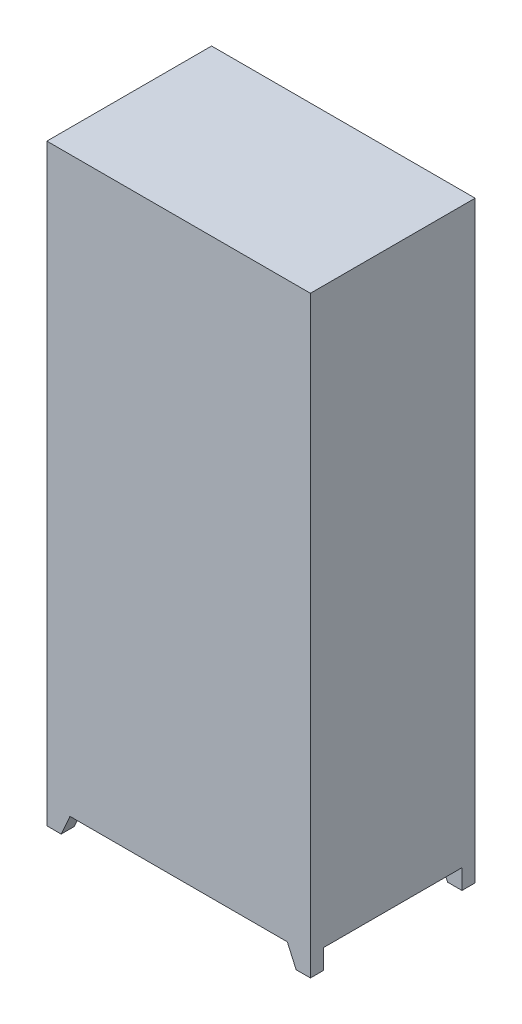
ISO-10303-21;
HEADER;
FILE_DESCRIPTION(('STEP AP214'),'2;1');
FILE_NAME('part.step','',(''),(''),'','','');
FILE_SCHEMA(('AUTOMOTIVE_DESIGN { 1 0 10303 214 1 1 1 1 }'));
ENDSEC;
DATA;
#1=APPLICATION_CONTEXT('core data for automotive mechanical design processes');
#2=APPLICATION_PROTOCOL_DEFINITION('international standard','automotive_design',2000,#1);
#3=PRODUCT_CONTEXT('',#1,'mechanical');
#4=PRODUCT('Part','Part','',(#3));
#5=PRODUCT_RELATED_PRODUCT_CATEGORY('part','',(#4));
#6=PRODUCT_DEFINITION_FORMATION('','',#4);
#7=PRODUCT_DEFINITION_CONTEXT('part definition',#1,'design');
#8=PRODUCT_DEFINITION('design','',#6,#7);
#9=PRODUCT_DEFINITION_SHAPE('','',#8);
#10=(LENGTH_UNIT() NAMED_UNIT(*) SI_UNIT(.MILLI.,.METRE.));
#11=(NAMED_UNIT(*) PLANE_ANGLE_UNIT() SI_UNIT($,.RADIAN.));
#12=(NAMED_UNIT(*) SI_UNIT($,.STERADIAN.) SOLID_ANGLE_UNIT());
#13=UNCERTAINTY_MEASURE_WITH_UNIT(LENGTH_MEASURE(1.E-05),#10,'distance_accuracy_value','');
#14=(GEOMETRIC_REPRESENTATION_CONTEXT(3) GLOBAL_UNCERTAINTY_ASSIGNED_CONTEXT((#13)) GLOBAL_UNIT_ASSIGNED_CONTEXT((#10,
#11,#12)) REPRESENTATION_CONTEXT('',''));
#15=CARTESIAN_POINT('',(0.,0.,0.));
#16=DIRECTION('',(0.,0.,1.));
#17=DIRECTION('',(1.,0.,0.));
#18=AXIS2_PLACEMENT_3D('',#15,#16,#17);
#19=CARTESIAN_POINT('',(0.,-106.68,63.5));
#20=DIRECTION('',(0.,1.,0.));
#21=DIRECTION('',(-1.,0.,0.));
#22=AXIS2_PLACEMENT_3D('',#19,#20,#21);
#23=PLANE('',#22);
#24=DIRECTION('',(1.,0.,0.));
#25=VECTOR('',#24,1.);
#26=CARTESIAN_POINT('',(0.,-106.68,63.5));
#27=LINE('',#26,#25);
#28=CARTESIAN_POINT('',(-41.9005340757414,-106.68,63.5));
#29=VERTEX_POINT('',#28);
#30=CARTESIAN_POINT('',(41.9005340757413,-106.68,63.5));
#31=VERTEX_POINT('',#30);
#32=EDGE_CURVE('E323',#29,#31,#27,.T.);
#33=ORIENTED_EDGE('',*,*,#32,.F.);
#34=DIRECTION('',(0.,0.,1.));
#35=VECTOR('',#34,1.);
#36=CARTESIAN_POINT('',(-41.9005340757414,-106.68,58.42));
#37=LINE('',#36,#35);
#38=CARTESIAN_POINT('',(-41.9005340757414,-106.68,58.42));
#39=VERTEX_POINT('',#38);
#40=EDGE_CURVE('E220',#39,#29,#37,.T.);
#41=ORIENTED_EDGE('',*,*,#40,.F.);
#42=DIRECTION('',(-1.,0.,0.));
#43=VECTOR('',#42,1.);
#44=CARTESIAN_POINT('',(0.,-106.68,58.42));
#45=LINE('',#44,#43);
#46=CARTESIAN_POINT('',(-50.8,-106.68,58.42));
#47=VERTEX_POINT('',#46);
#48=EDGE_CURVE('E212',#39,#47,#45,.T.);
#49=ORIENTED_EDGE('',*,*,#48,.T.);
#50=DIRECTION('',(0.,0.,-1.));
#51=VECTOR('',#50,1.);
#52=CARTESIAN_POINT('',(-50.8,-106.68,63.5));
#53=LINE('',#52,#51);
#54=CARTESIAN_POINT('',(-50.8,-106.68,5.08));
#55=VERTEX_POINT('',#54);
#56=EDGE_CURVE('E324',#47,#55,#53,.T.);
#57=ORIENTED_EDGE('',*,*,#56,.T.);
#58=DIRECTION('',(-1.,0.,0.));
#59=VECTOR('',#58,1.);
#60=CARTESIAN_POINT('',(0.,-106.68,5.08));
#61=LINE('',#60,#59);
#62=CARTESIAN_POINT('',(-41.9005340757414,-106.68,5.08));
#63=VERTEX_POINT('',#62);
#64=EDGE_CURVE('E258',#63,#55,#61,.T.);
#65=ORIENTED_EDGE('',*,*,#64,.F.);
#66=DIRECTION('',(0.,0.,-1.));
#67=VECTOR('',#66,1.);
#68=CARTESIAN_POINT('',(-41.9005340757414,-106.68,5.08));
#69=LINE('',#68,#67);
#70=CARTESIAN_POINT('',(-41.9005340757414,-106.68,0.));
#71=VERTEX_POINT('',#70);
#72=EDGE_CURVE('E277',#63,#71,#69,.T.);
#73=ORIENTED_EDGE('',*,*,#72,.T.);
#74=DIRECTION('',(1.,0.,0.));
#75=VECTOR('',#74,1.);
#76=CARTESIAN_POINT('',(0.,-106.68,0.));
#77=LINE('',#76,#75);
#78=CARTESIAN_POINT('',(41.9005340757413,-106.68,0.));
#79=VERTEX_POINT('',#78);
#80=EDGE_CURVE('E302',#71,#79,#77,.T.);
#81=ORIENTED_EDGE('',*,*,#80,.T.);
#82=DIRECTION('',(0.,0.,-1.));
#83=VECTOR('',#82,1.);
#84=CARTESIAN_POINT('',(41.9005340757413,-106.68,5.08));
#85=LINE('',#84,#83);
#86=CARTESIAN_POINT('',(41.9005340757413,-106.68,5.08));
#87=VERTEX_POINT('',#86);
#88=EDGE_CURVE('E299',#87,#79,#85,.T.);
#89=ORIENTED_EDGE('',*,*,#88,.F.);
#90=DIRECTION('',(1.,0.,0.));
#91=VECTOR('',#90,1.);
#92=CARTESIAN_POINT('',(0.,-106.68,5.08));
#93=LINE('',#92,#91);
#94=CARTESIAN_POINT('',(50.8,-106.68,5.08));
#95=VERTEX_POINT('',#94);
#96=EDGE_CURVE('E286',#87,#95,#93,.T.);
#97=ORIENTED_EDGE('',*,*,#96,.T.);
#98=DIRECTION('',(0.,0.,-1.));
#99=VECTOR('',#98,1.);
#100=CARTESIAN_POINT('',(50.8,-106.68,63.5));
#101=LINE('',#100,#99);
#102=CARTESIAN_POINT('',(50.8,-106.68,58.42));
#103=VERTEX_POINT('',#102);
#104=EDGE_CURVE('E11',#103,#95,#101,.T.);
#105=ORIENTED_EDGE('',*,*,#104,.F.);
#106=DIRECTION('',(1.,0.,0.));
#107=VECTOR('',#106,1.);
#108=CARTESIAN_POINT('',(0.,-106.68,58.42));
#109=LINE('',#108,#107);
#110=CARTESIAN_POINT('',(41.9005340757413,-106.68,58.42));
#111=VERTEX_POINT('',#110);
#112=EDGE_CURVE('E231',#111,#103,#109,.T.);
#113=ORIENTED_EDGE('',*,*,#112,.F.);
#114=DIRECTION('',(0.,0.,1.));
#115=VECTOR('',#114,1.);
#116=CARTESIAN_POINT('',(41.9005340757413,-106.68,58.42));
#117=LINE('',#116,#115);
#118=EDGE_CURVE('E242',#111,#31,#117,.T.);
#119=ORIENTED_EDGE('',*,*,#118,.T.);
#120=EDGE_LOOP('',(#33,#41,#49,#57,#65,#73,#81,#89,#97,#105,#113,#119));
#121=FACE_BOUND('',#120,.T.);
#122=ADVANCED_FACE('F33',(#121),#23,.F.);
#123=CARTESIAN_POINT('',(50.8,0.,63.5));
#124=DIRECTION('',(-1.,0.,0.));
#125=DIRECTION('',(0.,0.,1.));
#126=AXIS2_PLACEMENT_3D('',#123,#124,#125);
#127=PLANE('',#126);
#128=DIRECTION('',(0.,1.,0.));
#129=VECTOR('',#128,1.);
#130=CARTESIAN_POINT('',(50.8,0.,0.));
#131=LINE('',#130,#129);
#132=CARTESIAN_POINT('',(50.8,-114.3,0.));
#133=VERTEX_POINT('',#132);
#134=CARTESIAN_POINT('',(50.8,114.3,0.));
#135=VERTEX_POINT('',#134);
#136=EDGE_CURVE('E310',#133,#135,#131,.T.);
#137=ORIENTED_EDGE('',*,*,#136,.T.);
#138=DIRECTION('',(0.,0.,-1.));
#139=VECTOR('',#138,1.);
#140=CARTESIAN_POINT('',(50.8,114.3,63.5));
#141=LINE('',#140,#139);
#142=CARTESIAN_POINT('',(50.8,114.3,63.5));
#143=VERTEX_POINT('',#142);
#144=EDGE_CURVE('E41',#143,#135,#141,.T.);
#145=ORIENTED_EDGE('',*,*,#144,.F.);
#146=DIRECTION('',(0.,1.,0.));
#147=VECTOR('',#146,1.);
#148=CARTESIAN_POINT('',(50.8,0.,63.5));
#149=LINE('',#148,#147);
#150=CARTESIAN_POINT('',(50.8,-114.3,63.5));
#151=VERTEX_POINT('',#150);
#152=EDGE_CURVE('E365',#151,#143,#149,.T.);
#153=ORIENTED_EDGE('',*,*,#152,.F.);
#154=DIRECTION('',(0.,0.,1.));
#155=VECTOR('',#154,1.);
#156=CARTESIAN_POINT('',(50.8,-114.3,58.42));
#157=LINE('',#156,#155);
#158=CARTESIAN_POINT('',(50.8,-114.3,58.42));
#159=VERTEX_POINT('',#158);
#160=EDGE_CURVE('E247',#159,#151,#157,.T.);
#161=ORIENTED_EDGE('',*,*,#160,.F.);
#162=DIRECTION('',(0.,1.,0.));
#163=VECTOR('',#162,1.);
#164=CARTESIAN_POINT('',(50.8,0.,58.42));
#165=LINE('',#164,#163);
#166=EDGE_CURVE('E239',#159,#103,#165,.T.);
#167=ORIENTED_EDGE('',*,*,#166,.T.);
#168=ORIENTED_EDGE('',*,*,#104,.T.);
#169=DIRECTION('',(0.,1.,0.));
#170=VECTOR('',#169,1.);
#171=CARTESIAN_POINT('',(50.8,0.,5.08));
#172=LINE('',#171,#170);
#173=CARTESIAN_POINT('',(50.8,-114.3,5.08));
#174=VERTEX_POINT('',#173);
#175=EDGE_CURVE('E292',#174,#95,#172,.T.);
#176=ORIENTED_EDGE('',*,*,#175,.F.);
#177=DIRECTION('',(0.,0.,-1.));
#178=VECTOR('',#177,1.);
#179=CARTESIAN_POINT('',(50.8,-114.3,5.08));
#180=LINE('',#179,#178);
#181=EDGE_CURVE('E295',#174,#133,#180,.T.);
#182=ORIENTED_EDGE('',*,*,#181,.T.);
#183=EDGE_LOOP('',(#137,#145,#153,#161,#167,#168,#176,#182));
#184=FACE_BOUND('',#183,.T.);
#185=ADVANCED_FACE('F396',(#184),#127,.F.);
#186=CARTESIAN_POINT('',(0.,114.3,63.5));
#187=DIRECTION('',(0.,-1.,0.));
#188=DIRECTION('',(0.,0.,-1.));
#189=AXIS2_PLACEMENT_3D('',#186,#187,#188);
#190=PLANE('',#189);
#191=DIRECTION('',(-1.,0.,0.));
#192=VECTOR('',#191,1.);
#193=CARTESIAN_POINT('',(0.,114.3,0.));
#194=LINE('',#193,#192);
#195=CARTESIAN_POINT('',(-50.8,114.3,0.));
#196=VERTEX_POINT('',#195);
#197=EDGE_CURVE('E317',#135,#196,#194,.T.);
#198=ORIENTED_EDGE('',*,*,#197,.T.);
#199=DIRECTION('',(0.,0.,-1.));
#200=VECTOR('',#199,1.);
#201=CARTESIAN_POINT('',(-50.8,114.3,63.5));
#202=LINE('',#201,#200);
#203=CARTESIAN_POINT('',(-50.8,114.3,63.5));
#204=VERTEX_POINT('',#203);
#205=EDGE_CURVE('E326',#204,#196,#202,.T.);
#206=ORIENTED_EDGE('',*,*,#205,.F.);
#207=DIRECTION('',(-1.,0.,0.));
#208=VECTOR('',#207,1.);
#209=CARTESIAN_POINT('',(0.,114.3,63.5));
#210=LINE('',#209,#208);
#211=EDGE_CURVE('E334',#143,#204,#210,.T.);
#212=ORIENTED_EDGE('',*,*,#211,.F.);
#213=ORIENTED_EDGE('',*,*,#144,.T.);
#214=EDGE_LOOP('',(#198,#206,#212,#213));
#215=FACE_BOUND('',#214,.T.);
#216=ADVANCED_FACE('F332',(#215),#190,.F.);
#217=CARTESIAN_POINT('',(-50.8,0.,63.5));
#218=DIRECTION('',(-1.,0.,0.));
#219=DIRECTION('',(0.,0.,1.));
#220=AXIS2_PLACEMENT_3D('',#217,#218,#219);
#221=PLANE('',#220);
#222=DIRECTION('',(0.,1.,0.));
#223=VECTOR('',#222,1.);
#224=CARTESIAN_POINT('',(-50.8,0.,0.));
#225=LINE('',#224,#223);
#226=CARTESIAN_POINT('',(-50.8,-114.3,0.));
#227=VERTEX_POINT('',#226);
#228=EDGE_CURVE('E320',#227,#196,#225,.T.);
#229=ORIENTED_EDGE('',*,*,#228,.F.);
#230=DIRECTION('',(0.,0.,-1.));
#231=VECTOR('',#230,1.);
#232=CARTESIAN_POINT('',(-50.8,-114.3,5.08));
#233=LINE('',#232,#231);
#234=CARTESIAN_POINT('',(-50.8,-114.3,5.08));
#235=VERTEX_POINT('',#234);
#236=EDGE_CURVE('E274',#235,#227,#233,.T.);
#237=ORIENTED_EDGE('',*,*,#236,.F.);
#238=DIRECTION('',(0.,1.,0.));
#239=VECTOR('',#238,1.);
#240=CARTESIAN_POINT('',(-50.8,0.,5.08));
#241=LINE('',#240,#239);
#242=EDGE_CURVE('E262',#235,#55,#241,.T.);
#243=ORIENTED_EDGE('',*,*,#242,.T.);
#244=ORIENTED_EDGE('',*,*,#56,.F.);
#245=DIRECTION('',(0.,1.,0.));
#246=VECTOR('',#245,1.);
#247=CARTESIAN_POINT('',(-50.8,0.,58.42));
#248=LINE('',#247,#246);
#249=CARTESIAN_POINT('',(-50.8,-114.3,58.42));
#250=VERTEX_POINT('',#249);
#251=EDGE_CURVE('E216',#250,#47,#248,.T.);
#252=ORIENTED_EDGE('',*,*,#251,.F.);
#253=DIRECTION('',(0.,0.,1.));
#254=VECTOR('',#253,1.);
#255=CARTESIAN_POINT('',(-50.8,-114.3,58.42));
#256=LINE('',#255,#254);
#257=CARTESIAN_POINT('',(-50.8,-114.3,63.5));
#258=VERTEX_POINT('',#257);
#259=EDGE_CURVE('E227',#250,#258,#256,.T.);
#260=ORIENTED_EDGE('',*,*,#259,.T.);
#261=DIRECTION('',(0.,1.,0.));
#262=VECTOR('',#261,1.);
#263=CARTESIAN_POINT('',(-50.8,0.,63.5));
#264=LINE('',#263,#262);
#265=EDGE_CURVE('E314',#258,#204,#264,.T.);
#266=ORIENTED_EDGE('',*,*,#265,.T.);
#267=ORIENTED_EDGE('',*,*,#205,.T.);
#268=EDGE_LOOP('',(#229,#237,#243,#244,#252,#260,#266,#267));
#269=FACE_BOUND('',#268,.T.);
#270=ADVANCED_FACE('F341',(#269),#221,.T.);
#271=CARTESIAN_POINT('',(0.,0.,63.5));
#272=DIRECTION('',(0.,0.,1.));
#273=DIRECTION('',(1.,0.,0.));
#274=AXIS2_PLACEMENT_3D('',#271,#272,#273);
#275=PLANE('',#274);
#276=ORIENTED_EDGE('',*,*,#265,.F.);
#277=DIRECTION('',(-1.,0.,0.));
#278=VECTOR('',#277,1.);
#279=CARTESIAN_POINT('',(-2.87736061538738E-13,-114.3,63.5));
#280=LINE('',#279,#278);
#281=CARTESIAN_POINT('',(-45.287200742408,-114.3,63.5));
#282=VERTEX_POINT('',#281);
#283=EDGE_CURVE('E213',#282,#258,#280,.T.);
#284=ORIENTED_EDGE('',*,*,#283,.F.);
#285=DIRECTION('',(0.406138466053448,0.913811548620257,0.));
#286=VECTOR('',#285,1.);
#287=CARTESIAN_POINT('',(4.60347154499951,-2.04598735333312,63.5));
#288=LINE('',#287,#286);
#289=EDGE_CURVE('E56',#282,#29,#288,.T.);
#290=ORIENTED_EDGE('',*,*,#289,.T.);
#291=ORIENTED_EDGE('',*,*,#32,.T.);
#292=DIRECTION('',(0.406138466053447,-0.913811548620257,0.));
#293=VECTOR('',#292,1.);
#294=CARTESIAN_POINT('',(-4.60347154499946,-2.04598735333309,63.5));
#295=LINE('',#294,#293);
#296=CARTESIAN_POINT('',(45.287200742408,-114.3,63.5));
#297=VERTEX_POINT('',#296);
#298=EDGE_CURVE('E226',#31,#297,#295,.T.);
#299=ORIENTED_EDGE('',*,*,#298,.T.);
#300=DIRECTION('',(-1.,0.,0.));
#301=VECTOR('',#300,1.);
#302=CARTESIAN_POINT('',(5.75472123077472E-13,-114.3,63.5));
#303=LINE('',#302,#301);
#304=EDGE_CURVE('E234',#151,#297,#303,.T.);
#305=ORIENTED_EDGE('',*,*,#304,.F.);
#306=ORIENTED_EDGE('',*,*,#152,.T.);
#307=ORIENTED_EDGE('',*,*,#211,.T.);
#308=EDGE_LOOP('',(#276,#284,#290,#291,#299,#305,#306,#307));
#309=FACE_BOUND('',#308,.T.);
#310=ADVANCED_FACE('F407',(#309),#275,.T.);
#311=CARTESIAN_POINT('',(0.,0.,0.));
#312=DIRECTION('',(0.,0.,1.));
#313=DIRECTION('',(1.,0.,0.));
#314=AXIS2_PLACEMENT_3D('',#311,#312,#313);
#315=PLANE('',#314);
#316=DIRECTION('',(0.,1.,0.));
#317=VECTOR('',#316,1.);
#318=CARTESIAN_POINT('',(-45.72,0.,0.));
#319=LINE('',#318,#317);
#320=CARTESIAN_POINT('',(-45.72,-101.6,0.));
#321=VERTEX_POINT('',#320);
#322=CARTESIAN_POINT('',(-45.72,109.22,0.));
#323=VERTEX_POINT('',#322);
#324=EDGE_CURVE('E191',#321,#323,#319,.T.);
#325=ORIENTED_EDGE('',*,*,#324,.F.);
#326=DIRECTION('',(1.,0.,0.));
#327=VECTOR('',#326,1.);
#328=CARTESIAN_POINT('',(0.,-101.6,0.));
#329=LINE('',#328,#327);
#330=CARTESIAN_POINT('',(45.72,-101.6,0.));
#331=VERTEX_POINT('',#330);
#332=EDGE_CURVE('E175',#321,#331,#329,.T.);
#333=ORIENTED_EDGE('',*,*,#332,.T.);
#334=DIRECTION('',(0.,1.,0.));
#335=VECTOR('',#334,1.);
#336=CARTESIAN_POINT('',(45.72,0.,0.));
#337=LINE('',#336,#335);
#338=CARTESIAN_POINT('',(45.72,109.22,0.));
#339=VERTEX_POINT('',#338);
#340=EDGE_CURVE('E183',#331,#339,#337,.T.);
#341=ORIENTED_EDGE('',*,*,#340,.T.);
#342=DIRECTION('',(-1.,0.,0.));
#343=VECTOR('',#342,1.);
#344=CARTESIAN_POINT('',(0.,109.22,0.));
#345=LINE('',#344,#343);
#346=EDGE_CURVE('E48',#339,#323,#345,.T.);
#347=ORIENTED_EDGE('',*,*,#346,.T.);
#348=EDGE_LOOP('',(#325,#333,#341,#347));
#349=FACE_BOUND('',#348,.T.);
#350=ORIENTED_EDGE('',*,*,#80,.F.);
#351=DIRECTION('',(0.406138466053448,0.913811548620257,0.));
#352=VECTOR('',#351,1.);
#353=CARTESIAN_POINT('',(4.60347154499951,-2.04598735333312,0.));
#354=LINE('',#353,#352);
#355=CARTESIAN_POINT('',(-45.287200742408,-114.3,0.));
#356=VERTEX_POINT('',#355);
#357=EDGE_CURVE('E250',#356,#71,#354,.T.);
#358=ORIENTED_EDGE('',*,*,#357,.F.);
#359=DIRECTION('',(-1.,0.,0.));
#360=VECTOR('',#359,1.);
#361=CARTESIAN_POINT('',(-2.87736061538738E-13,-114.3,0.));
#362=LINE('',#361,#360);
#363=EDGE_CURVE('E259',#356,#227,#362,.T.);
#364=ORIENTED_EDGE('',*,*,#363,.T.);
#365=ORIENTED_EDGE('',*,*,#228,.T.);
#366=ORIENTED_EDGE('',*,*,#197,.F.);
#367=ORIENTED_EDGE('',*,*,#136,.F.);
#368=DIRECTION('',(-1.,0.,0.));
#369=VECTOR('',#368,1.);
#370=CARTESIAN_POINT('',(5.75472123077472E-13,-114.3,0.));
#371=LINE('',#370,#369);
#372=CARTESIAN_POINT('',(45.287200742408,-114.3,0.));
#373=VERTEX_POINT('',#372);
#374=EDGE_CURVE('E289',#133,#373,#371,.T.);
#375=ORIENTED_EDGE('',*,*,#374,.T.);
#376=DIRECTION('',(0.406138466053447,-0.913811548620257,0.));
#377=VECTOR('',#376,1.);
#378=CARTESIAN_POINT('',(-4.60347154499946,-2.04598735333309,0.));
#379=LINE('',#378,#377);
#380=EDGE_CURVE('E280',#79,#373,#379,.T.);
#381=ORIENTED_EDGE('',*,*,#380,.F.);
#382=EDGE_LOOP('',(#350,#358,#364,#365,#366,#367,#375,#381));
#383=FACE_BOUND('',#382,.T.);
#384=ADVANCED_FACE('F188',(#349,#383),#315,.F.);
#385=CARTESIAN_POINT('',(-4.60347154499946,-2.04598735333309,5.08));
#386=DIRECTION('',(0.913811548620257,0.406138466053447,0.));
#387=DIRECTION('',(-0.406138466053447,0.913811548620257,0.));
#388=AXIS2_PLACEMENT_3D('',#385,#386,#387);
#389=PLANE('',#388);
#390=ORIENTED_EDGE('',*,*,#380,.T.);
#391=DIRECTION('',(0.,0.,-1.));
#392=VECTOR('',#391,1.);
#393=CARTESIAN_POINT('',(45.287200742408,-114.3,5.08));
#394=LINE('',#393,#392);
#395=CARTESIAN_POINT('',(45.287200742408,-114.3,5.08));
#396=VERTEX_POINT('',#395);
#397=EDGE_CURVE('E303',#396,#373,#394,.T.);
#398=ORIENTED_EDGE('',*,*,#397,.F.);
#399=DIRECTION('',(0.406138466053447,-0.913811548620257,0.));
#400=VECTOR('',#399,1.);
#401=CARTESIAN_POINT('',(-4.60347154499946,-2.04598735333309,5.08));
#402=LINE('',#401,#400);
#403=EDGE_CURVE('E283',#87,#396,#402,.T.);
#404=ORIENTED_EDGE('',*,*,#403,.F.);
#405=ORIENTED_EDGE('',*,*,#88,.T.);
#406=EDGE_LOOP('',(#390,#398,#404,#405));
#407=FACE_BOUND('',#406,.T.);
#408=ADVANCED_FACE('F380',(#407),#389,.F.);
#409=CARTESIAN_POINT('',(5.75472123077472E-13,-114.3,5.08));
#410=DIRECTION('',(0.,-1.,0.));
#411=DIRECTION('',(1.,0.,0.));
#412=AXIS2_PLACEMENT_3D('',#409,#410,#411);
#413=PLANE('',#412);
#414=ORIENTED_EDGE('',*,*,#374,.F.);
#415=ORIENTED_EDGE('',*,*,#181,.F.);
#416=DIRECTION('',(-1.,0.,0.));
#417=VECTOR('',#416,1.);
#418=CARTESIAN_POINT('',(5.75472123077472E-13,-114.3,5.08));
#419=LINE('',#418,#417);
#420=EDGE_CURVE('E296',#174,#396,#419,.T.);
#421=ORIENTED_EDGE('',*,*,#420,.T.);
#422=ORIENTED_EDGE('',*,*,#397,.T.);
#423=EDGE_LOOP('',(#414,#415,#421,#422));
#424=FACE_BOUND('',#423,.T.);
#425=ADVANCED_FACE('F383',(#424),#413,.T.);
#426=CARTESIAN_POINT('',(0.,0.,5.08));
#427=DIRECTION('',(0.,0.,1.));
#428=DIRECTION('',(1.,0.,0.));
#429=AXIS2_PLACEMENT_3D('',#426,#427,#428);
#430=PLANE('',#429);
#431=ORIENTED_EDGE('',*,*,#96,.F.);
#432=ORIENTED_EDGE('',*,*,#403,.T.);
#433=ORIENTED_EDGE('',*,*,#420,.F.);
#434=ORIENTED_EDGE('',*,*,#175,.T.);
#435=EDGE_LOOP('',(#431,#432,#433,#434));
#436=FACE_BOUND('',#435,.T.);
#437=ADVANCED_FACE('F377',(#436),#430,.T.);
#438=CARTESIAN_POINT('',(4.60347154499951,-2.04598735333312,5.08));
#439=DIRECTION('',(-0.913811548620257,0.406138466053448,0.));
#440=DIRECTION('',(-0.406138466053448,-0.913811548620257,0.));
#441=AXIS2_PLACEMENT_3D('',#438,#439,#440);
#442=PLANE('',#441);
#443=ORIENTED_EDGE('',*,*,#357,.T.);
#444=ORIENTED_EDGE('',*,*,#72,.F.);
#445=DIRECTION('',(0.406138466053448,0.913811548620257,0.));
#446=VECTOR('',#445,1.);
#447=CARTESIAN_POINT('',(4.60347154499951,-2.04598735333312,5.08));
#448=LINE('',#447,#446);
#449=CARTESIAN_POINT('',(-45.287200742408,-114.3,5.08));
#450=VERTEX_POINT('',#449);
#451=EDGE_CURVE('E255',#450,#63,#448,.T.);
#452=ORIENTED_EDGE('',*,*,#451,.F.);
#453=DIRECTION('',(0.,0.,-1.));
#454=VECTOR('',#453,1.);
#455=CARTESIAN_POINT('',(-45.287200742408,-114.3,5.08));
#456=LINE('',#455,#454);
#457=EDGE_CURVE('E268',#450,#356,#456,.T.);
#458=ORIENTED_EDGE('',*,*,#457,.T.);
#459=EDGE_LOOP('',(#443,#444,#452,#458));
#460=FACE_BOUND('',#459,.T.);
#461=ADVANCED_FACE('F386',(#460),#442,.F.);
#462=CARTESIAN_POINT('',(-2.87736061538738E-13,-114.3,5.08));
#463=DIRECTION('',(0.,-1.,0.));
#464=DIRECTION('',(1.,0.,0.));
#465=AXIS2_PLACEMENT_3D('',#462,#463,#464);
#466=PLANE('',#465);
#467=ORIENTED_EDGE('',*,*,#363,.F.);
#468=ORIENTED_EDGE('',*,*,#457,.F.);
#469=DIRECTION('',(-1.,0.,0.));
#470=VECTOR('',#469,1.);
#471=CARTESIAN_POINT('',(-2.87736061538738E-13,-114.3,5.08));
#472=LINE('',#471,#470);
#473=EDGE_CURVE('E265',#450,#235,#472,.T.);
#474=ORIENTED_EDGE('',*,*,#473,.T.);
#475=ORIENTED_EDGE('',*,*,#236,.T.);
#476=EDGE_LOOP('',(#467,#468,#474,#475));
#477=FACE_BOUND('',#476,.T.);
#478=ADVANCED_FACE('F345',(#477),#466,.T.);
#479=CARTESIAN_POINT('',(0.,0.,5.08));
#480=DIRECTION('',(0.,0.,1.));
#481=DIRECTION('',(1.,0.,0.));
#482=AXIS2_PLACEMENT_3D('',#479,#480,#481);
#483=PLANE('',#482);
#484=ORIENTED_EDGE('',*,*,#451,.T.);
#485=ORIENTED_EDGE('',*,*,#64,.T.);
#486=ORIENTED_EDGE('',*,*,#242,.F.);
#487=ORIENTED_EDGE('',*,*,#473,.F.);
#488=EDGE_LOOP('',(#484,#485,#486,#487));
#489=FACE_BOUND('',#488,.T.);
#490=ADVANCED_FACE('F349',(#489),#483,.T.);
#491=CARTESIAN_POINT('',(5.75472123077472E-13,-114.3,58.42));
#492=DIRECTION('',(0.,1.,0.));
#493=DIRECTION('',(-1.,0.,0.));
#494=AXIS2_PLACEMENT_3D('',#491,#492,#493);
#495=PLANE('',#494);
#496=ORIENTED_EDGE('',*,*,#304,.T.);
#497=DIRECTION('',(0.,0.,1.));
#498=VECTOR('',#497,1.);
#499=CARTESIAN_POINT('',(45.287200742408,-114.3,58.42));
#500=LINE('',#499,#498);
#501=CARTESIAN_POINT('',(45.287200742408,-114.3,58.42));
#502=VERTEX_POINT('',#501);
#503=EDGE_CURVE('E251',#502,#297,#500,.T.);
#504=ORIENTED_EDGE('',*,*,#503,.F.);
#505=DIRECTION('',(-1.,0.,0.));
#506=VECTOR('',#505,1.);
#507=CARTESIAN_POINT('',(5.75472123077472E-13,-114.3,58.42));
#508=LINE('',#507,#506);
#509=EDGE_CURVE('E237',#159,#502,#508,.T.);
#510=ORIENTED_EDGE('',*,*,#509,.F.);
#511=ORIENTED_EDGE('',*,*,#160,.T.);
#512=EDGE_LOOP('',(#496,#504,#510,#511));
#513=FACE_BOUND('',#512,.T.);
#514=ADVANCED_FACE('F441',(#513),#495,.F.);
#515=CARTESIAN_POINT('',(-4.60347154499946,-2.04598735333309,58.42));
#516=DIRECTION('',(-0.913811548620257,-0.406138466053447,0.));
#517=DIRECTION('',(0.406138466053447,-0.913811548620257,0.));
#518=AXIS2_PLACEMENT_3D('',#515,#516,#517);
#519=PLANE('',#518);
#520=ORIENTED_EDGE('',*,*,#298,.F.);
#521=ORIENTED_EDGE('',*,*,#118,.F.);
#522=DIRECTION('',(0.406138466053447,-0.913811548620257,0.));
#523=VECTOR('',#522,1.);
#524=CARTESIAN_POINT('',(-4.60347154499946,-2.04598735333309,58.42));
#525=LINE('',#524,#523);
#526=EDGE_CURVE('E233',#111,#502,#525,.T.);
#527=ORIENTED_EDGE('',*,*,#526,.T.);
#528=ORIENTED_EDGE('',*,*,#503,.T.);
#529=EDGE_LOOP('',(#520,#521,#527,#528));
#530=FACE_BOUND('',#529,.T.);
#531=ADVANCED_FACE('F475',(#530),#519,.T.);
#532=CARTESIAN_POINT('',(0.,0.,58.42));
#533=DIRECTION('',(0.,0.,1.));
#534=DIRECTION('',(1.,0.,0.));
#535=AXIS2_PLACEMENT_3D('',#532,#533,#534);
#536=PLANE('',#535);
#537=ORIENTED_EDGE('',*,*,#112,.T.);
#538=ORIENTED_EDGE('',*,*,#166,.F.);
#539=ORIENTED_EDGE('',*,*,#509,.T.);
#540=ORIENTED_EDGE('',*,*,#526,.F.);
#541=EDGE_LOOP('',(#537,#538,#539,#540));
#542=FACE_BOUND('',#541,.T.);
#543=ADVANCED_FACE('F485',(#542),#536,.F.);
#544=CARTESIAN_POINT('',(4.60347154499951,-2.04598735333312,58.42));
#545=DIRECTION('',(0.913811548620257,-0.406138466053448,0.));
#546=DIRECTION('',(0.406138466053448,0.913811548620257,0.));
#547=AXIS2_PLACEMENT_3D('',#544,#545,#546);
#548=PLANE('',#547);
#549=ORIENTED_EDGE('',*,*,#289,.F.);
#550=DIRECTION('',(0.,0.,1.));
#551=VECTOR('',#550,1.);
#552=CARTESIAN_POINT('',(-45.287200742408,-114.3,58.42));
#553=LINE('',#552,#551);
#554=CARTESIAN_POINT('',(-45.287200742408,-114.3,58.42));
#555=VERTEX_POINT('',#554);
#556=EDGE_CURVE('E224',#555,#282,#553,.T.);
#557=ORIENTED_EDGE('',*,*,#556,.F.);
#558=DIRECTION('',(0.406138466053448,0.913811548620257,0.));
#559=VECTOR('',#558,1.);
#560=CARTESIAN_POINT('',(4.60347154499951,-2.04598735333312,58.42));
#561=LINE('',#560,#559);
#562=EDGE_CURVE('E209',#555,#39,#561,.T.);
#563=ORIENTED_EDGE('',*,*,#562,.T.);
#564=ORIENTED_EDGE('',*,*,#40,.T.);
#565=EDGE_LOOP('',(#549,#557,#563,#564));
#566=FACE_BOUND('',#565,.T.);
#567=ADVANCED_FACE('F360',(#566),#548,.T.);
#568=CARTESIAN_POINT('',(-2.87736061538738E-13,-114.3,58.42));
#569=DIRECTION('',(0.,1.,0.));
#570=DIRECTION('',(-1.,0.,0.));
#571=AXIS2_PLACEMENT_3D('',#568,#569,#570);
#572=PLANE('',#571);
#573=ORIENTED_EDGE('',*,*,#283,.T.);
#574=ORIENTED_EDGE('',*,*,#259,.F.);
#575=DIRECTION('',(-1.,0.,0.));
#576=VECTOR('',#575,1.);
#577=CARTESIAN_POINT('',(-2.87736061538738E-13,-114.3,58.42));
#578=LINE('',#577,#576);
#579=EDGE_CURVE('E218',#555,#250,#578,.T.);
#580=ORIENTED_EDGE('',*,*,#579,.F.);
#581=ORIENTED_EDGE('',*,*,#556,.T.);
#582=EDGE_LOOP('',(#573,#574,#580,#581));
#583=FACE_BOUND('',#582,.T.);
#584=ADVANCED_FACE('F364',(#583),#572,.F.);
#585=CARTESIAN_POINT('',(0.,0.,58.42));
#586=DIRECTION('',(0.,0.,1.));
#587=DIRECTION('',(1.,0.,0.));
#588=AXIS2_PLACEMENT_3D('',#585,#586,#587);
#589=PLANE('',#588);
#590=ORIENTED_EDGE('',*,*,#562,.F.);
#591=ORIENTED_EDGE('',*,*,#579,.T.);
#592=ORIENTED_EDGE('',*,*,#251,.T.);
#593=ORIENTED_EDGE('',*,*,#48,.F.);
#594=EDGE_LOOP('',(#590,#591,#592,#593));
#595=FACE_BOUND('',#594,.T.);
#596=ADVANCED_FACE('F358',(#595),#589,.F.);
#597=CARTESIAN_POINT('',(0.,-101.6,63.5));
#598=DIRECTION('',(0.,1.,0.));
#599=DIRECTION('',(-1.,0.,0.));
#600=AXIS2_PLACEMENT_3D('',#597,#598,#599);
#601=PLANE('',#600);
#602=DIRECTION('',(0.,0.,-1.));
#603=VECTOR('',#602,1.);
#604=CARTESIAN_POINT('',(45.72,-101.6,63.5));
#605=LINE('',#604,#603);
#606=CARTESIAN_POINT('',(45.72,-101.6,58.42));
#607=VERTEX_POINT('',#606);
#608=EDGE_CURVE('E170',#607,#331,#605,.T.);
#609=ORIENTED_EDGE('',*,*,#608,.T.);
#610=ORIENTED_EDGE('',*,*,#332,.F.);
#611=DIRECTION('',(0.,0.,-1.));
#612=VECTOR('',#611,1.);
#613=CARTESIAN_POINT('',(-45.72,-101.6,63.5));
#614=LINE('',#613,#612);
#615=CARTESIAN_POINT('',(-45.72,-101.6,58.42));
#616=VERTEX_POINT('',#615);
#617=EDGE_CURVE('E194',#616,#321,#614,.T.);
#618=ORIENTED_EDGE('',*,*,#617,.F.);
#619=DIRECTION('',(1.,0.,0.));
#620=VECTOR('',#619,1.);
#621=CARTESIAN_POINT('',(0.,-101.6,58.42));
#622=LINE('',#621,#620);
#623=EDGE_CURVE('E177',#616,#607,#622,.T.);
#624=ORIENTED_EDGE('',*,*,#623,.T.);
#625=EDGE_LOOP('',(#609,#610,#618,#624));
#626=FACE_BOUND('',#625,.T.);
#627=ADVANCED_FACE('F172',(#626),#601,.T.);
#628=CARTESIAN_POINT('',(45.72,0.,63.5));
#629=DIRECTION('',(-1.,0.,0.));
#630=DIRECTION('',(0.,0.,1.));
#631=AXIS2_PLACEMENT_3D('',#628,#629,#630);
#632=PLANE('',#631);
#633=DIRECTION('',(0.,1.,0.));
#634=VECTOR('',#633,1.);
#635=CARTESIAN_POINT('',(45.72,0.,58.42));
#636=LINE('',#635,#634);
#637=CARTESIAN_POINT('',(45.72,109.22,58.42));
#638=VERTEX_POINT('',#637);
#639=EDGE_CURVE('E199',#607,#638,#636,.T.);
#640=ORIENTED_EDGE('',*,*,#639,.T.);
#641=DIRECTION('',(0.,0.,-1.));
#642=VECTOR('',#641,1.);
#643=CARTESIAN_POINT('',(45.72,109.22,63.5));
#644=LINE('',#643,#642);
#645=EDGE_CURVE('E180',#638,#339,#644,.T.);
#646=ORIENTED_EDGE('',*,*,#645,.T.);
#647=ORIENTED_EDGE('',*,*,#340,.F.);
#648=ORIENTED_EDGE('',*,*,#608,.F.);
#649=EDGE_LOOP('',(#640,#646,#647,#648));
#650=FACE_BOUND('',#649,.T.);
#651=ADVANCED_FACE('F184',(#650),#632,.T.);
#652=CARTESIAN_POINT('',(0.,109.22,63.5));
#653=DIRECTION('',(0.,-1.,0.));
#654=DIRECTION('',(0.,0.,-1.));
#655=AXIS2_PLACEMENT_3D('',#652,#653,#654);
#656=PLANE('',#655);
#657=ORIENTED_EDGE('',*,*,#346,.F.);
#658=ORIENTED_EDGE('',*,*,#645,.F.);
#659=DIRECTION('',(-1.,0.,0.));
#660=VECTOR('',#659,1.);
#661=CARTESIAN_POINT('',(0.,109.22,58.42));
#662=LINE('',#661,#660);
#663=CARTESIAN_POINT('',(-45.72,109.22,58.42));
#664=VERTEX_POINT('',#663);
#665=EDGE_CURVE('E201',#638,#664,#662,.T.);
#666=ORIENTED_EDGE('',*,*,#665,.T.);
#667=DIRECTION('',(0.,0.,-1.));
#668=VECTOR('',#667,1.);
#669=CARTESIAN_POINT('',(-45.72,109.22,63.5));
#670=LINE('',#669,#668);
#671=EDGE_CURVE('E198',#664,#323,#670,.T.);
#672=ORIENTED_EDGE('',*,*,#671,.T.);
#673=EDGE_LOOP('',(#657,#658,#666,#672));
#674=FACE_BOUND('',#673,.T.);
#675=ADVANCED_FACE('F547',(#674),#656,.T.);
#676=CARTESIAN_POINT('',(-45.72,0.,63.5));
#677=DIRECTION('',(-1.,0.,0.));
#678=DIRECTION('',(0.,0.,1.));
#679=AXIS2_PLACEMENT_3D('',#676,#677,#678);
#680=PLANE('',#679);
#681=ORIENTED_EDGE('',*,*,#324,.T.);
#682=ORIENTED_EDGE('',*,*,#671,.F.);
#683=DIRECTION('',(0.,1.,0.));
#684=VECTOR('',#683,1.);
#685=CARTESIAN_POINT('',(-45.72,0.,58.42));
#686=LINE('',#685,#684);
#687=EDGE_CURVE('E205',#616,#664,#686,.T.);
#688=ORIENTED_EDGE('',*,*,#687,.F.);
#689=ORIENTED_EDGE('',*,*,#617,.T.);
#690=EDGE_LOOP('',(#681,#682,#688,#689));
#691=FACE_BOUND('',#690,.T.);
#692=ADVANCED_FACE('F557',(#691),#680,.F.);
#693=CARTESIAN_POINT('',(0.,0.,58.42));
#694=DIRECTION('',(0.,0.,1.));
#695=DIRECTION('',(1.,0.,0.));
#696=AXIS2_PLACEMENT_3D('',#693,#694,#695);
#697=PLANE('',#696);
#698=ORIENTED_EDGE('',*,*,#623,.F.);
#699=ORIENTED_EDGE('',*,*,#687,.T.);
#700=ORIENTED_EDGE('',*,*,#665,.F.);
#701=ORIENTED_EDGE('',*,*,#639,.F.);
#702=EDGE_LOOP('',(#698,#699,#700,#701));
#703=FACE_BOUND('',#702,.T.);
#704=ADVANCED_FACE('F567',(#703),#697,.F.);
#705=CLOSED_SHELL('',(#122,#185,#216,#270,#310,#384,#408,#425,#437,#461,#478,#490,#514,#531,
#543,#567,#584,#596,#627,#651,#675,#692,#704));
#706=MANIFOLD_SOLID_BREP('B2',#705);
#707=ADVANCED_BREP_SHAPE_REPRESENTATION('',(#18,#706),#14);
#708=SHAPE_DEFINITION_REPRESENTATION(#9,#707);
ENDSEC;
END-ISO-10303-21;
